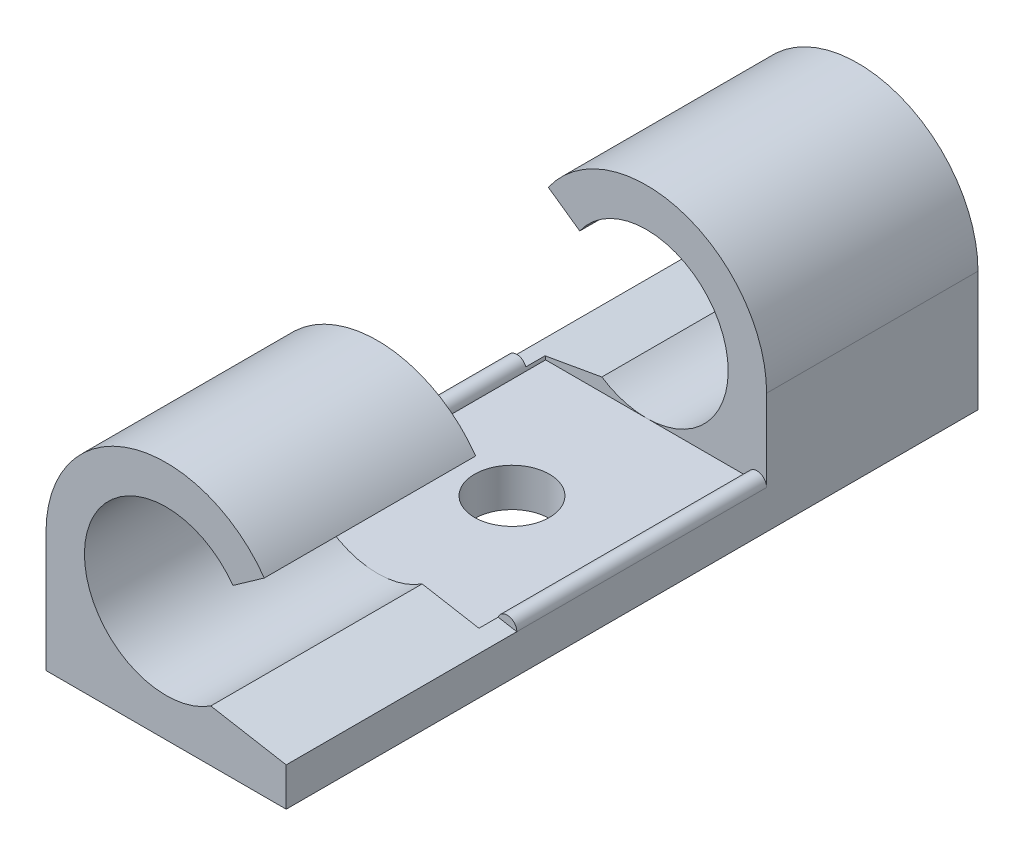
ISO-10303-21;
HEADER;
FILE_DESCRIPTION(('STEP AP214'),'2;1');
FILE_NAME('part.step','',(''),(''),'','','');
FILE_SCHEMA(('AUTOMOTIVE_DESIGN { 1 0 10303 214 1 1 1 1 }'));
ENDSEC;
DATA;
#1=APPLICATION_CONTEXT('core data for automotive mechanical design processes');
#2=APPLICATION_PROTOCOL_DEFINITION('international standard','automotive_design',2000,#1);
#3=PRODUCT_CONTEXT('',#1,'mechanical');
#4=PRODUCT('Part','Part','',(#3));
#5=PRODUCT_RELATED_PRODUCT_CATEGORY('part','',(#4));
#6=PRODUCT_DEFINITION_FORMATION('','',#4);
#7=PRODUCT_DEFINITION_CONTEXT('part definition',#1,'design');
#8=PRODUCT_DEFINITION('design','',#6,#7);
#9=PRODUCT_DEFINITION_SHAPE('','',#8);
#10=(LENGTH_UNIT() NAMED_UNIT(*) SI_UNIT(.MILLI.,.METRE.));
#11=(NAMED_UNIT(*) PLANE_ANGLE_UNIT() SI_UNIT($,.RADIAN.));
#12=(NAMED_UNIT(*) SI_UNIT($,.STERADIAN.) SOLID_ANGLE_UNIT());
#13=UNCERTAINTY_MEASURE_WITH_UNIT(LENGTH_MEASURE(1.E-05),#10,'distance_accuracy_value','');
#14=(GEOMETRIC_REPRESENTATION_CONTEXT(3) GLOBAL_UNCERTAINTY_ASSIGNED_CONTEXT((#13)) GLOBAL_UNIT_ASSIGNED_CONTEXT((#10,
#11,#12)) REPRESENTATION_CONTEXT('',''));
#15=CARTESIAN_POINT('',(0.,0.,0.));
#16=DIRECTION('',(0.,0.,1.));
#17=DIRECTION('',(1.,0.,0.));
#18=AXIS2_PLACEMENT_3D('',#15,#16,#17);
#19=CARTESIAN_POINT('',(0.,0.,11.));
#20=DIRECTION('',(0.,0.,1.));
#21=DIRECTION('',(1.,0.,0.));
#22=AXIS2_PLACEMENT_3D('',#19,#20,#21);
#23=PLANE('',#22);
#24=CARTESIAN_POINT('',(0.,0.,11.));
#25=DIRECTION('',(0.,0.,1.));
#26=DIRECTION('',(1.,0.,0.));
#27=AXIS2_PLACEMENT_3D('',#24,#25,#26);
#28=CIRCLE('',#27,6.25);
#29=CARTESIAN_POINT('',(6.25,0.,11.));
#30=VERTEX_POINT('',#29);
#31=CARTESIAN_POINT('',(-5.10966953026548,3.59913563115876,11.));
#32=VERTEX_POINT('',#31);
#33=EDGE_CURVE('E195',#30,#32,#28,.T.);
#34=ORIENTED_EDGE('',*,*,#33,.T.);
#35=DIRECTION('',(0.817547124842476,-0.575861700985402,0.));
#36=VECTOR('',#35,1.);
#37=CARTESIAN_POINT('',(0.,0.,11.));
#38=LINE('',#37,#36);
#39=CARTESIAN_POINT('',(-3.47457528058052,2.44741222918796,11.));
#40=VERTEX_POINT('',#39);
#41=EDGE_CURVE('E255',#32,#40,#38,.T.);
#42=ORIENTED_EDGE('',*,*,#41,.T.);
#43=CARTESIAN_POINT('',(0.,0.,11.));
#44=DIRECTION('',(0.,0.,1.));
#45=DIRECTION('',(1.,0.,0.));
#46=AXIS2_PLACEMENT_3D('',#43,#44,#45);
#47=CIRCLE('',#46,4.25);
#48=CARTESIAN_POINT('',(0.,-4.25,11.));
#49=VERTEX_POINT('',#48);
#50=EDGE_CURVE('E179',#49,#40,#47,.T.);
#51=ORIENTED_EDGE('',*,*,#50,.F.);
#52=DIRECTION('',(-1.,0.,0.));
#53=VECTOR('',#52,1.);
#54=CARTESIAN_POINT('',(-6.25,-4.25,11.));
#55=LINE('',#54,#53);
#56=CARTESIAN_POINT('',(5.25,-4.25,11.));
#57=VERTEX_POINT('',#56);
#58=EDGE_CURVE('E242',#57,#49,#55,.T.);
#59=ORIENTED_EDGE('',*,*,#58,.F.);
#60=CARTESIAN_POINT('',(5.75,-4.25,11.));
#61=DIRECTION('',(0.,0.,1.));
#62=DIRECTION('',(1.,0.,0.));
#63=AXIS2_PLACEMENT_3D('',#60,#61,#62);
#64=CIRCLE('',#63,0.5);
#65=CARTESIAN_POINT('',(6.25,-4.25,11.));
#66=VERTEX_POINT('',#65);
#67=EDGE_CURVE('E236',#57,#66,#64,.F.);
#68=ORIENTED_EDGE('',*,*,#67,.T.);
#69=DIRECTION('',(0.,-1.,0.));
#70=VECTOR('',#69,1.);
#71=CARTESIAN_POINT('',(6.25,0.,11.));
#72=LINE('',#71,#70);
#73=EDGE_CURVE('E247',#30,#66,#72,.T.);
#74=ORIENTED_EDGE('',*,*,#73,.F.);
#75=EDGE_LOOP('',(#34,#42,#51,#59,#68,#74));
#76=FACE_BOUND('',#75,.T.);
#77=ADVANCED_FACE('F41',(#76),#23,.T.);
#78=CARTESIAN_POINT('',(-2.32467896088748,-3.55785999286188,11.));
#79=VERTEX_POINT('',#78);
#80=EDGE_CURVE('E204',#79,#49,#47,.T.);
#81=ORIENTED_EDGE('',*,*,#80,.F.);
#82=DIRECTION('',(-0.984807753012208,-0.17364817766693,0.));
#83=VECTOR('',#82,1.);
#84=CARTESIAN_POINT('',(0.53833224452301,-3.05303387127734,11.));
#85=LINE('',#84,#83);
#86=CARTESIAN_POINT('',(-5.28015368960705,-4.07898992833716,11.));
#87=VERTEX_POINT('',#86);
#88=EDGE_CURVE('E259',#79,#87,#85,.T.);
#89=ORIENTED_EDGE('',*,*,#88,.T.);
#90=CARTESIAN_POINT('',(-5.75,-4.25,11.));
#91=DIRECTION('',(0.,0.,1.));
#92=DIRECTION('',(1.,0.,0.));
#93=AXIS2_PLACEMENT_3D('',#90,#91,#92);
#94=CIRCLE('',#93,0.5);
#95=CARTESIAN_POINT('',(-5.25,-4.25,11.));
#96=VERTEX_POINT('',#95);
#97=EDGE_CURVE('E228',#96,#87,#94,.T.);
#98=ORIENTED_EDGE('',*,*,#97,.F.);
#99=EDGE_CURVE('E212',#49,#96,#55,.T.);
#100=ORIENTED_EDGE('',*,*,#99,.F.);
#101=EDGE_LOOP('',(#81,#89,#98,#100));
#102=FACE_BOUND('',#101,.T.);
#103=ADVANCED_FACE('F356',(#102),#23,.T.);
#104=CARTESIAN_POINT('',(0.,0.,11.));
#105=DIRECTION('',(0.,0.,-1.));
#106=DIRECTION('',(-1.,0.,0.));
#107=AXIS2_PLACEMENT_3D('',#104,#105,#106);
#108=CYLINDRICAL_SURFACE('',#107,6.25);
#109=DIRECTION('',(0.,0.,-1.));
#110=VECTOR('',#109,1.);
#111=CARTESIAN_POINT('',(-5.10966953026548,3.59913563115876,12.));
#112=LINE('',#111,#110);
#113=CARTESIAN_POINT('',(-5.10966953026548,3.59913563115876,0.));
#114=VERTEX_POINT('',#113);
#115=EDGE_CURVE('E56',#32,#114,#112,.T.);
#116=ORIENTED_EDGE('',*,*,#115,.F.);
#117=ORIENTED_EDGE('',*,*,#33,.F.);
#118=DIRECTION('',(0.,0.,-1.));
#119=VECTOR('',#118,1.);
#120=CARTESIAN_POINT('',(6.25,0.,11.));
#121=LINE('',#120,#119);
#122=CARTESIAN_POINT('',(6.25,0.,0.));
#123=VERTEX_POINT('',#122);
#124=EDGE_CURVE('E208',#30,#123,#121,.T.);
#125=ORIENTED_EDGE('',*,*,#124,.T.);
#126=CARTESIAN_POINT('',(0.,0.,0.));
#127=DIRECTION('',(0.,0.,1.));
#128=DIRECTION('',(1.,0.,0.));
#129=AXIS2_PLACEMENT_3D('',#126,#127,#128);
#130=CIRCLE('',#129,6.25);
#131=EDGE_CURVE('E200',#123,#114,#130,.T.);
#132=ORIENTED_EDGE('',*,*,#131,.T.);
#133=EDGE_LOOP('',(#116,#117,#125,#132));
#134=FACE_BOUND('',#133,.T.);
#135=ADVANCED_FACE('F258',(#134),#108,.T.);
#136=CARTESIAN_POINT('',(0.,0.,11.));
#137=DIRECTION('',(0.,0.,-1.));
#138=DIRECTION('',(-1.,0.,0.));
#139=AXIS2_PLACEMENT_3D('',#136,#137,#138);
#140=CYLINDRICAL_SURFACE('',#139,4.25);
#141=ORIENTED_EDGE('',*,*,#50,.T.);
#142=DIRECTION('',(0.,0.,-1.));
#143=VECTOR('',#142,1.);
#144=CARTESIAN_POINT('',(-3.47457528058052,2.44741222918796,12.));
#145=LINE('',#144,#143);
#146=CARTESIAN_POINT('',(-3.47457528058052,2.44741222918796,0.));
#147=VERTEX_POINT('',#146);
#148=EDGE_CURVE('E165',#40,#147,#145,.T.);
#149=ORIENTED_EDGE('',*,*,#148,.T.);
#150=CARTESIAN_POINT('',(0.,0.,0.));
#151=DIRECTION('',(0.,0.,1.));
#152=DIRECTION('',(1.,0.,0.));
#153=AXIS2_PLACEMENT_3D('',#150,#151,#152);
#154=CIRCLE('',#153,4.25);
#155=CARTESIAN_POINT('',(-2.32467896088748,-3.55785999286188,0.));
#156=VERTEX_POINT('',#155);
#157=EDGE_CURVE('E177',#156,#147,#154,.T.);
#158=ORIENTED_EDGE('',*,*,#157,.F.);
#159=DIRECTION('',(0.,0.,-1.));
#160=VECTOR('',#159,1.);
#161=CARTESIAN_POINT('',(-2.32467896088748,-3.55785999286188,12.));
#162=LINE('',#161,#160);
#163=EDGE_CURVE('E180',#79,#156,#162,.T.);
#164=ORIENTED_EDGE('',*,*,#163,.F.);
#165=ORIENTED_EDGE('',*,*,#80,.T.);
#166=EDGE_LOOP('',(#141,#149,#158,#164,#165));
#167=FACE_BOUND('',#166,.T.);
#168=ADVANCED_FACE('F43',(#167),#140,.F.);
#169=CARTESIAN_POINT('',(-6.25,0.,11.));
#170=DIRECTION('',(1.,0.,0.));
#171=DIRECTION('',(0.,1.,0.));
#172=AXIS2_PLACEMENT_3D('',#169,#170,#171);
#173=PLANE('',#172);
#174=DIRECTION('',(0.,0.,-1.));
#175=VECTOR('',#174,1.);
#176=CARTESIAN_POINT('',(-6.25,-4.25,12.));
#177=LINE('',#176,#175);
#178=CARTESIAN_POINT('',(-6.25,-4.25,12.));
#179=VERTEX_POINT('',#178);
#180=CARTESIAN_POINT('',(-6.25,-4.25,0.));
#181=VERTEX_POINT('',#180);
#182=EDGE_CURVE('E223',#179,#181,#177,.T.);
#183=ORIENTED_EDGE('',*,*,#182,.T.);
#184=DIRECTION('',(0.,-1.,0.));
#185=VECTOR('',#184,1.);
#186=CARTESIAN_POINT('',(-6.25,0.,0.));
#187=LINE('',#186,#185);
#188=CARTESIAN_POINT('',(-6.25,-6.25,0.));
#189=VERTEX_POINT('',#188);
#190=EDGE_CURVE('E202',#181,#189,#187,.T.);
#191=ORIENTED_EDGE('',*,*,#190,.T.);
#192=DIRECTION('',(0.,0.,-1.));
#193=VECTOR('',#192,1.);
#194=CARTESIAN_POINT('',(-6.25,-6.25,11.));
#195=LINE('',#194,#193);
#196=CARTESIAN_POINT('',(-6.25,-6.25,36.));
#197=VERTEX_POINT('',#196);
#198=EDGE_CURVE('E205',#197,#189,#195,.T.);
#199=ORIENTED_EDGE('',*,*,#198,.F.);
#200=DIRECTION('',(0.,-1.,0.));
#201=VECTOR('',#200,1.);
#202=CARTESIAN_POINT('',(-6.25,0.,36.));
#203=LINE('',#202,#201);
#204=CARTESIAN_POINT('',(-6.25,0.,36.));
#205=VERTEX_POINT('',#204);
#206=EDGE_CURVE('E327',#205,#197,#203,.T.);
#207=ORIENTED_EDGE('',*,*,#206,.F.);
#208=DIRECTION('',(0.,0.,1.));
#209=VECTOR('',#208,1.);
#210=CARTESIAN_POINT('',(-6.25,0.,25.));
#211=LINE('',#210,#209);
#212=CARTESIAN_POINT('',(-6.25,0.,25.));
#213=VERTEX_POINT('',#212);
#214=EDGE_CURVE('E317',#213,#205,#211,.T.);
#215=ORIENTED_EDGE('',*,*,#214,.F.);
#216=DIRECTION('',(0.,-1.,0.));
#217=VECTOR('',#216,1.);
#218=CARTESIAN_POINT('',(-6.25,0.,25.));
#219=LINE('',#218,#217);
#220=CARTESIAN_POINT('',(-6.25,-4.25,25.));
#221=VERTEX_POINT('',#220);
#222=EDGE_CURVE('E314',#213,#221,#219,.T.);
#223=ORIENTED_EDGE('',*,*,#222,.T.);
#224=DIRECTION('',(0.,0.,-1.));
#225=VECTOR('',#224,1.);
#226=CARTESIAN_POINT('',(-6.25,-4.25,18.));
#227=LINE('',#226,#225);
#228=EDGE_CURVE('E245',#221,#179,#227,.T.);
#229=ORIENTED_EDGE('',*,*,#228,.T.);
#230=EDGE_LOOP('',(#183,#191,#199,#207,#215,#223,#229));
#231=FACE_BOUND('',#230,.T.);
#232=ADVANCED_FACE('F359',(#231),#173,.F.);
#233=CARTESIAN_POINT('',(0.,0.,0.));
#234=DIRECTION('',(0.,0.,1.));
#235=DIRECTION('',(1.,0.,0.));
#236=AXIS2_PLACEMENT_3D('',#233,#234,#235);
#237=PLANE('',#236);
#238=DIRECTION('',(-0.817547124842476,0.575861700985402,0.));
#239=VECTOR('',#238,1.);
#240=CARTESIAN_POINT('',(0.,0.,0.));
#241=LINE('',#240,#239);
#242=EDGE_CURVE('E162',#147,#114,#241,.T.);
#243=ORIENTED_EDGE('',*,*,#242,.T.);
#244=ORIENTED_EDGE('',*,*,#131,.F.);
#245=DIRECTION('',(0.,-1.,0.));
#246=VECTOR('',#245,1.);
#247=CARTESIAN_POINT('',(6.25,0.,0.));
#248=LINE('',#247,#246);
#249=CARTESIAN_POINT('',(6.25,-6.25,0.));
#250=VERTEX_POINT('',#249);
#251=EDGE_CURVE('E190',#123,#250,#248,.T.);
#252=ORIENTED_EDGE('',*,*,#251,.T.);
#253=DIRECTION('',(1.,0.,0.));
#254=VECTOR('',#253,1.);
#255=CARTESIAN_POINT('',(0.,-6.25,0.));
#256=LINE('',#255,#254);
#257=EDGE_CURVE('E186',#189,#250,#256,.T.);
#258=ORIENTED_EDGE('',*,*,#257,.F.);
#259=ORIENTED_EDGE('',*,*,#190,.F.);
#260=DIRECTION('',(0.984807753012208,0.17364817766693,0.));
#261=VECTOR('',#260,1.);
#262=CARTESIAN_POINT('',(0.53833224452301,-3.05303387127734,0.));
#263=LINE('',#262,#261);
#264=EDGE_CURVE('E171',#181,#156,#263,.T.);
#265=ORIENTED_EDGE('',*,*,#264,.T.);
#266=ORIENTED_EDGE('',*,*,#157,.T.);
#267=EDGE_LOOP('',(#243,#244,#252,#258,#259,#265,#266));
#268=FACE_BOUND('',#267,.T.);
#269=ADVANCED_FACE('F183',(#268),#237,.F.);
#270=CARTESIAN_POINT('',(-5.75,-4.25,9.8819660112501));
#271=DIRECTION('',(0.,0.,1.));
#272=DIRECTION('',(1.,0.,0.));
#273=AXIS2_PLACEMENT_3D('',#270,#271,#272);
#274=CYLINDRICAL_SURFACE('',#273,0.5);
#275=DIRECTION('',(0.,0.,1.));
#276=VECTOR('',#275,1.);
#277=CARTESIAN_POINT('',(-5.28015368960705,-4.07898992833716,9.8819660112501));
#278=LINE('',#277,#276);
#279=CARTESIAN_POINT('',(-5.28015368960705,-4.07898992833716,12.));
#280=VERTEX_POINT('',#279);
#281=EDGE_CURVE('E11',#280,#87,#278,.F.);
#282=ORIENTED_EDGE('',*,*,#281,.F.);
#283=CARTESIAN_POINT('',(-5.75,-4.25,12.));
#284=DIRECTION('',(0.,0.,-1.));
#285=DIRECTION('',(-1.,0.,0.));
#286=AXIS2_PLACEMENT_3D('',#283,#284,#285);
#287=CIRCLE('',#286,0.5);
#288=EDGE_CURVE('E49',#179,#280,#287,.T.);
#289=ORIENTED_EDGE('',*,*,#288,.F.);
#290=ORIENTED_EDGE('',*,*,#228,.F.);
#291=CARTESIAN_POINT('',(-5.75,-4.25,25.));
#292=DIRECTION('',(0.,0.,1.));
#293=DIRECTION('',(1.,0.,0.));
#294=AXIS2_PLACEMENT_3D('',#291,#292,#293);
#295=CIRCLE('',#294,0.5);
#296=CARTESIAN_POINT('',(-5.25,-4.25,25.));
#297=VERTEX_POINT('',#296);
#298=EDGE_CURVE('E296',#297,#221,#295,.T.);
#299=ORIENTED_EDGE('',*,*,#298,.F.);
#300=DIRECTION('',(0.,0.,1.));
#301=VECTOR('',#300,1.);
#302=CARTESIAN_POINT('',(-5.25,-4.25,9.8819660112501));
#303=LINE('',#302,#301);
#304=EDGE_CURVE('E230',#96,#297,#303,.T.);
#305=ORIENTED_EDGE('',*,*,#304,.F.);
#306=ORIENTED_EDGE('',*,*,#97,.T.);
#307=EDGE_LOOP('',(#282,#289,#290,#299,#305,#306));
#308=FACE_BOUND('',#307,.T.);
#309=ADVANCED_FACE('F226',(#308),#274,.T.);
#310=CARTESIAN_POINT('',(6.25,0.,11.));
#311=DIRECTION('',(1.,0.,0.));
#312=DIRECTION('',(0.,0.,-1.));
#313=AXIS2_PLACEMENT_3D('',#310,#311,#312);
#314=PLANE('',#313);
#315=DIRECTION('',(0.,0.,-1.));
#316=VECTOR('',#315,1.);
#317=CARTESIAN_POINT('',(6.25,-4.25,18.));
#318=LINE('',#317,#316);
#319=CARTESIAN_POINT('',(6.25,-4.25,36.));
#320=VERTEX_POINT('',#319);
#321=CARTESIAN_POINT('',(6.25,-4.25,24.));
#322=VERTEX_POINT('',#321);
#323=EDGE_CURVE('E187',#320,#322,#318,.T.);
#324=ORIENTED_EDGE('',*,*,#323,.F.);
#325=DIRECTION('',(0.,-1.,0.));
#326=VECTOR('',#325,1.);
#327=CARTESIAN_POINT('',(6.25,0.,36.));
#328=LINE('',#327,#326);
#329=CARTESIAN_POINT('',(6.25,-6.25,36.));
#330=VERTEX_POINT('',#329);
#331=EDGE_CURVE('E323',#320,#330,#328,.T.);
#332=ORIENTED_EDGE('',*,*,#331,.T.);
#333=DIRECTION('',(0.,0.,-1.));
#334=VECTOR('',#333,1.);
#335=CARTESIAN_POINT('',(6.25,-6.25,11.));
#336=LINE('',#335,#334);
#337=EDGE_CURVE('E210',#330,#250,#336,.T.);
#338=ORIENTED_EDGE('',*,*,#337,.T.);
#339=ORIENTED_EDGE('',*,*,#251,.F.);
#340=ORIENTED_EDGE('',*,*,#124,.F.);
#341=ORIENTED_EDGE('',*,*,#73,.T.);
#342=EDGE_CURVE('E192',#322,#66,#318,.T.);
#343=ORIENTED_EDGE('',*,*,#342,.F.);
#344=EDGE_LOOP('',(#324,#332,#338,#339,#340,#341,#343));
#345=FACE_BOUND('',#344,.T.);
#346=ADVANCED_FACE('F379',(#345),#314,.T.);
#347=CARTESIAN_POINT('',(5.75,-4.25,9.8819660112501));
#348=DIRECTION('',(0.,0.,1.));
#349=DIRECTION('',(1.,0.,0.));
#350=AXIS2_PLACEMENT_3D('',#347,#348,#349);
#351=CYLINDRICAL_SURFACE('',#350,0.5);
#352=CARTESIAN_POINT('',(5.75,-4.25,25.));
#353=DIRECTION('',(0.,0.,1.));
#354=DIRECTION('',(1.,0.,0.));
#355=AXIS2_PLACEMENT_3D('',#352,#353,#354);
#356=CIRCLE('',#355,0.5);
#357=CARTESIAN_POINT('',(5.25,-4.25,25.));
#358=VERTEX_POINT('',#357);
#359=CARTESIAN_POINT('',(5.28015368960705,-4.07898992833716,25.));
#360=VERTEX_POINT('',#359);
#361=EDGE_CURVE('E299',#358,#360,#356,.F.);
#362=ORIENTED_EDGE('',*,*,#361,.T.);
#363=DIRECTION('',(0.,0.,1.));
#364=VECTOR('',#363,1.);
#365=CARTESIAN_POINT('',(5.28015368960705,-4.07898992833716,9.8819660112501));
#366=LINE('',#365,#364);
#367=CARTESIAN_POINT('',(5.28015368960705,-4.07898992833716,24.));
#368=VERTEX_POINT('',#367);
#369=EDGE_CURVE('E289',#360,#368,#366,.F.);
#370=ORIENTED_EDGE('',*,*,#369,.T.);
#371=CARTESIAN_POINT('',(5.75,-4.25,24.));
#372=DIRECTION('',(0.,0.,1.));
#373=DIRECTION('',(1.,0.,0.));
#374=AXIS2_PLACEMENT_3D('',#371,#372,#373);
#375=CIRCLE('',#374,0.5);
#376=EDGE_CURVE('E213',#368,#322,#375,.F.);
#377=ORIENTED_EDGE('',*,*,#376,.T.);
#378=ORIENTED_EDGE('',*,*,#342,.T.);
#379=ORIENTED_EDGE('',*,*,#67,.F.);
#380=DIRECTION('',(0.,0.,1.));
#381=VECTOR('',#380,1.);
#382=CARTESIAN_POINT('',(5.25,-4.25,9.8819660112501));
#383=LINE('',#382,#381);
#384=EDGE_CURVE('E234',#57,#358,#383,.T.);
#385=ORIENTED_EDGE('',*,*,#384,.T.);
#386=EDGE_LOOP('',(#362,#370,#377,#378,#379,#385));
#387=FACE_BOUND('',#386,.T.);
#388=ADVANCED_FACE('F353',(#387),#351,.T.);
#389=CARTESIAN_POINT('',(0.,0.,25.));
#390=DIRECTION('',(0.,0.,-1.));
#391=DIRECTION('',(1.,0.,0.));
#392=AXIS2_PLACEMENT_3D('',#389,#390,#391);
#393=PLANE('',#392);
#394=CARTESIAN_POINT('',(0.,0.,25.));
#395=DIRECTION('',(0.,0.,1.));
#396=DIRECTION('',(1.,0.,0.));
#397=AXIS2_PLACEMENT_3D('',#394,#395,#396);
#398=CIRCLE('',#397,4.25);
#399=CARTESIAN_POINT('',(0.,-4.25,25.));
#400=VERTEX_POINT('',#399);
#401=CARTESIAN_POINT('',(2.32467896088749,-3.55785999286188,25.));
#402=VERTEX_POINT('',#401);
#403=EDGE_CURVE('E308',#400,#402,#398,.T.);
#404=ORIENTED_EDGE('',*,*,#403,.T.);
#405=DIRECTION('',(0.984807753012208,-0.17364817766693,0.));
#406=VECTOR('',#405,1.);
#407=CARTESIAN_POINT('',(-0.538332244523009,-3.05303387127734,25.));
#408=LINE('',#407,#406);
#409=EDGE_CURVE('E286',#402,#360,#408,.T.);
#410=ORIENTED_EDGE('',*,*,#409,.T.);
#411=ORIENTED_EDGE('',*,*,#361,.F.);
#412=DIRECTION('',(-1.,0.,0.));
#413=VECTOR('',#412,1.);
#414=CARTESIAN_POINT('',(-6.25,-4.25,25.));
#415=LINE('',#414,#413);
#416=EDGE_CURVE('E302',#358,#400,#415,.T.);
#417=ORIENTED_EDGE('',*,*,#416,.T.);
#418=EDGE_LOOP('',(#404,#410,#411,#417));
#419=FACE_BOUND('',#418,.T.);
#420=ADVANCED_FACE('F351',(#419),#393,.T.);
#421=CARTESIAN_POINT('',(0.,0.,25.));
#422=DIRECTION('',(0.,0.,1.));
#423=DIRECTION('',(1.,0.,0.));
#424=AXIS2_PLACEMENT_3D('',#421,#422,#423);
#425=CIRCLE('',#424,6.25);
#426=CARTESIAN_POINT('',(5.10943474902635,3.59946892547248,25.));
#427=VERTEX_POINT('',#426);
#428=EDGE_CURVE('E311',#427,#213,#425,.T.);
#429=ORIENTED_EDGE('',*,*,#428,.F.);
#430=DIRECTION('',(-0.817509559844216,-0.575915028075597,0.));
#431=VECTOR('',#430,1.);
#432=CARTESIAN_POINT('',(0.,0.,25.));
#433=LINE('',#432,#431);
#434=CARTESIAN_POINT('',(3.47441562933792,2.44763886932129,25.));
#435=VERTEX_POINT('',#434);
#436=EDGE_CURVE('E279',#427,#435,#433,.T.);
#437=ORIENTED_EDGE('',*,*,#436,.T.);
#438=EDGE_CURVE('E312',#435,#400,#398,.T.);
#439=ORIENTED_EDGE('',*,*,#438,.T.);
#440=EDGE_CURVE('E238',#400,#297,#415,.T.);
#441=ORIENTED_EDGE('',*,*,#440,.T.);
#442=ORIENTED_EDGE('',*,*,#298,.T.);
#443=ORIENTED_EDGE('',*,*,#222,.F.);
#444=EDGE_LOOP('',(#429,#437,#439,#441,#442,#443));
#445=FACE_BOUND('',#444,.T.);
#446=ADVANCED_FACE('F338',(#445),#393,.T.);
#447=CARTESIAN_POINT('',(0.,0.,25.));
#448=DIRECTION('',(0.,0.,1.));
#449=DIRECTION('',(-1.,0.,0.));
#450=AXIS2_PLACEMENT_3D('',#447,#448,#449);
#451=CYLINDRICAL_SURFACE('',#450,6.25);
#452=DIRECTION('',(0.,0.,1.));
#453=VECTOR('',#452,1.);
#454=CARTESIAN_POINT('',(5.10943474902635,3.59946892547248,24.));
#455=LINE('',#454,#453);
#456=CARTESIAN_POINT('',(5.10943474902635,3.59946892547248,36.));
#457=VERTEX_POINT('',#456);
#458=EDGE_CURVE('E271',#427,#457,#455,.T.);
#459=ORIENTED_EDGE('',*,*,#458,.F.);
#460=ORIENTED_EDGE('',*,*,#428,.T.);
#461=ORIENTED_EDGE('',*,*,#214,.T.);
#462=CARTESIAN_POINT('',(0.,0.,36.));
#463=DIRECTION('',(0.,0.,1.));
#464=DIRECTION('',(1.,0.,0.));
#465=AXIS2_PLACEMENT_3D('',#462,#463,#464);
#466=CIRCLE('',#465,6.25);
#467=EDGE_CURVE('E325',#457,#205,#466,.T.);
#468=ORIENTED_EDGE('',*,*,#467,.F.);
#469=EDGE_LOOP('',(#459,#460,#461,#468));
#470=FACE_BOUND('',#469,.T.);
#471=ADVANCED_FACE('F369',(#470),#451,.T.);
#472=CARTESIAN_POINT('',(0.,0.,25.));
#473=DIRECTION('',(0.,0.,1.));
#474=DIRECTION('',(-1.,0.,0.));
#475=AXIS2_PLACEMENT_3D('',#472,#473,#474);
#476=CYLINDRICAL_SURFACE('',#475,4.25);
#477=CARTESIAN_POINT('',(0.,0.,36.));
#478=DIRECTION('',(0.,0.,1.));
#479=DIRECTION('',(1.,0.,0.));
#480=AXIS2_PLACEMENT_3D('',#477,#478,#479);
#481=CIRCLE('',#480,4.25);
#482=CARTESIAN_POINT('',(3.47441562933792,2.44763886932129,36.));
#483=VERTEX_POINT('',#482);
#484=CARTESIAN_POINT('',(2.32467896088749,-3.55785999286187,36.));
#485=VERTEX_POINT('',#484);
#486=EDGE_CURVE('E307',#483,#485,#481,.T.);
#487=ORIENTED_EDGE('',*,*,#486,.T.);
#488=DIRECTION('',(0.,0.,1.));
#489=VECTOR('',#488,1.);
#490=CARTESIAN_POINT('',(2.32467896088749,-3.55785999286188,24.));
#491=LINE('',#490,#489);
#492=EDGE_CURVE('E277',#402,#485,#491,.T.);
#493=ORIENTED_EDGE('',*,*,#492,.F.);
#494=ORIENTED_EDGE('',*,*,#403,.F.);
#495=ORIENTED_EDGE('',*,*,#438,.F.);
#496=DIRECTION('',(0.,0.,1.));
#497=VECTOR('',#496,1.);
#498=CARTESIAN_POINT('',(3.47441562933792,2.44763886932129,24.));
#499=LINE('',#498,#497);
#500=EDGE_CURVE('E280',#435,#483,#499,.T.);
#501=ORIENTED_EDGE('',*,*,#500,.T.);
#502=EDGE_LOOP('',(#487,#493,#494,#495,#501));
#503=FACE_BOUND('',#502,.T.);
#504=ADVANCED_FACE('F349',(#503),#476,.F.);
#505=CARTESIAN_POINT('',(0.,0.,36.));
#506=DIRECTION('',(0.,0.,-1.));
#507=DIRECTION('',(1.,0.,0.));
#508=AXIS2_PLACEMENT_3D('',#505,#506,#507);
#509=PLANE('',#508);
#510=DIRECTION('',(-0.984807753012208,0.17364817766693,0.));
#511=VECTOR('',#510,1.);
#512=CARTESIAN_POINT('',(-0.53833224452301,-3.05303387127734,36.));
#513=LINE('',#512,#511);
#514=EDGE_CURVE('E267',#320,#485,#513,.T.);
#515=ORIENTED_EDGE('',*,*,#514,.T.);
#516=ORIENTED_EDGE('',*,*,#486,.F.);
#517=DIRECTION('',(0.817509559844216,0.575915028075597,0.));
#518=VECTOR('',#517,1.);
#519=CARTESIAN_POINT('',(0.,0.,36.));
#520=LINE('',#519,#518);
#521=EDGE_CURVE('E272',#483,#457,#520,.T.);
#522=ORIENTED_EDGE('',*,*,#521,.T.);
#523=ORIENTED_EDGE('',*,*,#467,.T.);
#524=ORIENTED_EDGE('',*,*,#206,.T.);
#525=DIRECTION('',(1.,0.,0.));
#526=VECTOR('',#525,1.);
#527=CARTESIAN_POINT('',(0.,-6.25,36.));
#528=LINE('',#527,#526);
#529=EDGE_CURVE('E320',#197,#330,#528,.T.);
#530=ORIENTED_EDGE('',*,*,#529,.T.);
#531=ORIENTED_EDGE('',*,*,#331,.F.);
#532=EDGE_LOOP('',(#515,#516,#522,#523,#524,#530,#531));
#533=FACE_BOUND('',#532,.T.);
#534=ADVANCED_FACE('F367',(#533),#509,.F.);
#535=CARTESIAN_POINT('',(-6.25,-4.25,18.));
#536=DIRECTION('',(0.,-1.,0.));
#537=DIRECTION('',(0.,0.,-1.));
#538=AXIS2_PLACEMENT_3D('',#535,#536,#537);
#539=PLANE('',#538);
#540=CARTESIAN_POINT('',(0.,-4.25,18.));
#541=DIRECTION('',(0.,1.,0.));
#542=DIRECTION('',(0.,0.,1.));
#543=AXIS2_PLACEMENT_3D('',#540,#541,#542);
#544=CIRCLE('',#543,1.95);
#545=CARTESIAN_POINT('',(0.,-4.25,19.95));
#546=VERTEX_POINT('',#545);
#547=EDGE_CURVE('E292',#546,#546,#544,.T.);
#548=ORIENTED_EDGE('',*,*,#547,.F.);
#549=EDGE_LOOP('',(#548));
#550=FACE_BOUND('',#549,.T.);
#551=ORIENTED_EDGE('',*,*,#304,.T.);
#552=ORIENTED_EDGE('',*,*,#440,.F.);
#553=ORIENTED_EDGE('',*,*,#416,.F.);
#554=ORIENTED_EDGE('',*,*,#384,.F.);
#555=ORIENTED_EDGE('',*,*,#58,.T.);
#556=ORIENTED_EDGE('',*,*,#99,.T.);
#557=EDGE_LOOP('',(#551,#552,#553,#554,#555,#556));
#558=FACE_BOUND('',#557,.T.);
#559=ADVANCED_FACE('F344',(#550,#558),#539,.F.);
#560=CARTESIAN_POINT('',(0.,-6.25,11.));
#561=DIRECTION('',(0.,1.,0.));
#562=DIRECTION('',(-1.,0.,0.));
#563=AXIS2_PLACEMENT_3D('',#560,#561,#562);
#564=PLANE('',#563);
#565=CARTESIAN_POINT('',(0.,-6.25,18.));
#566=DIRECTION('',(0.,1.,0.));
#567=DIRECTION('',(0.,0.,1.));
#568=AXIS2_PLACEMENT_3D('',#565,#566,#567);
#569=CIRCLE('',#568,1.95);
#570=CARTESIAN_POINT('',(0.,-6.25,19.95));
#571=VERTEX_POINT('',#570);
#572=EDGE_CURVE('E293',#571,#571,#569,.T.);
#573=ORIENTED_EDGE('',*,*,#572,.T.);
#574=EDGE_LOOP('',(#573));
#575=FACE_BOUND('',#574,.T.);
#576=ORIENTED_EDGE('',*,*,#257,.T.);
#577=ORIENTED_EDGE('',*,*,#337,.F.);
#578=ORIENTED_EDGE('',*,*,#529,.F.);
#579=ORIENTED_EDGE('',*,*,#198,.T.);
#580=EDGE_LOOP('',(#576,#577,#578,#579));
#581=FACE_BOUND('',#580,.T.);
#582=ADVANCED_FACE('F363',(#575,#581),#564,.F.);
#583=CARTESIAN_POINT('',(0.,-6.25,18.));
#584=DIRECTION('',(0.,1.,0.));
#585=DIRECTION('',(0.,0.,1.));
#586=AXIS2_PLACEMENT_3D('',#583,#584,#585);
#587=CYLINDRICAL_SURFACE('',#586,1.95);
#588=ORIENTED_EDGE('',*,*,#572,.F.);
#589=EDGE_LOOP('',(#588));
#590=FACE_BOUND('',#589,.T.);
#591=ORIENTED_EDGE('',*,*,#547,.T.);
#592=EDGE_LOOP('',(#591));
#593=FACE_BOUND('',#592,.T.);
#594=ADVANCED_FACE('F504',(#590,#593),#587,.F.);
#595=CARTESIAN_POINT('',(0.,0.,24.));
#596=DIRECTION('',(0.575915028075597,-0.817509559844216,0.));
#597=DIRECTION('',(0.817509559844216,0.575915028075597,0.));
#598=AXIS2_PLACEMENT_3D('',#595,#596,#597);
#599=PLANE('',#598);
#600=ORIENTED_EDGE('',*,*,#458,.T.);
#601=ORIENTED_EDGE('',*,*,#521,.F.);
#602=ORIENTED_EDGE('',*,*,#500,.F.);
#603=ORIENTED_EDGE('',*,*,#436,.F.);
#604=EDGE_LOOP('',(#600,#601,#602,#603));
#605=FACE_BOUND('',#604,.T.);
#606=ADVANCED_FACE('F371',(#605),#599,.T.);
#607=CARTESIAN_POINT('',(-0.53833224452301,-3.05303387127734,24.));
#608=DIRECTION('',(0.17364817766693,0.984807753012208,0.));
#609=DIRECTION('',(-0.984807753012208,0.17364817766693,0.));
#610=AXIS2_PLACEMENT_3D('',#607,#608,#609);
#611=PLANE('',#610);
#612=ORIENTED_EDGE('',*,*,#409,.F.);
#613=ORIENTED_EDGE('',*,*,#492,.T.);
#614=ORIENTED_EDGE('',*,*,#514,.F.);
#615=ORIENTED_EDGE('',*,*,#323,.T.);
#616=DIRECTION('',(-0.984807753012208,0.17364817766693,0.));
#617=VECTOR('',#616,1.);
#618=CARTESIAN_POINT('',(-0.53833224452301,-3.05303387127734,24.));
#619=LINE('',#618,#617);
#620=EDGE_CURVE('E268',#322,#368,#619,.T.);
#621=ORIENTED_EDGE('',*,*,#620,.T.);
#622=ORIENTED_EDGE('',*,*,#369,.F.);
#623=EDGE_LOOP('',(#612,#613,#614,#615,#621,#622));
#624=FACE_BOUND('',#623,.T.);
#625=ADVANCED_FACE('F375',(#624),#611,.T.);
#626=CARTESIAN_POINT('',(0.,0.,24.));
#627=DIRECTION('',(0.,0.,1.));
#628=DIRECTION('',(1.,0.,0.));
#629=AXIS2_PLACEMENT_3D('',#626,#627,#628);
#630=PLANE('',#629);
#631=ORIENTED_EDGE('',*,*,#620,.F.);
#632=ORIENTED_EDGE('',*,*,#376,.F.);
#633=EDGE_LOOP('',(#631,#632));
#634=FACE_BOUND('',#633,.T.);
#635=ADVANCED_FACE('F378',(#634),#630,.T.);
#636=CARTESIAN_POINT('',(0.,0.,12.));
#637=DIRECTION('',(0.,0.,-1.));
#638=DIRECTION('',(-1.,0.,0.));
#639=AXIS2_PLACEMENT_3D('',#636,#637,#638);
#640=PLANE('',#639);
#641=ORIENTED_EDGE('',*,*,#288,.T.);
#642=DIRECTION('',(0.984807753012208,0.17364817766693,0.));
#643=VECTOR('',#642,1.);
#644=CARTESIAN_POINT('',(0.53833224452301,-3.05303387127734,12.));
#645=LINE('',#644,#643);
#646=EDGE_CURVE('E63',#179,#280,#645,.T.);
#647=ORIENTED_EDGE('',*,*,#646,.F.);
#648=EDGE_LOOP('',(#641,#647));
#649=FACE_BOUND('',#648,.T.);
#650=ADVANCED_FACE('F216',(#649),#640,.T.);
#651=CARTESIAN_POINT('',(0.53833224452301,-3.05303387127734,12.));
#652=DIRECTION('',(-0.17364817766693,0.984807753012208,0.));
#653=DIRECTION('',(-0.984807753012208,-0.17364817766693,0.));
#654=AXIS2_PLACEMENT_3D('',#651,#652,#653);
#655=PLANE('',#654);
#656=ORIENTED_EDGE('',*,*,#163,.T.);
#657=ORIENTED_EDGE('',*,*,#264,.F.);
#658=ORIENTED_EDGE('',*,*,#182,.F.);
#659=ORIENTED_EDGE('',*,*,#646,.T.);
#660=ORIENTED_EDGE('',*,*,#281,.T.);
#661=ORIENTED_EDGE('',*,*,#88,.F.);
#662=EDGE_LOOP('',(#656,#657,#658,#659,#660,#661));
#663=FACE_BOUND('',#662,.T.);
#664=ADVANCED_FACE('F221',(#663),#655,.T.);
#665=CARTESIAN_POINT('',(0.,0.,12.));
#666=DIRECTION('',(-0.575861700985402,-0.817547124842476,0.));
#667=DIRECTION('',(0.817547124842476,-0.575861700985402,0.));
#668=AXIS2_PLACEMENT_3D('',#665,#666,#667);
#669=PLANE('',#668);
#670=ORIENTED_EDGE('',*,*,#115,.T.);
#671=ORIENTED_EDGE('',*,*,#242,.F.);
#672=ORIENTED_EDGE('',*,*,#148,.F.);
#673=ORIENTED_EDGE('',*,*,#41,.F.);
#674=EDGE_LOOP('',(#670,#671,#672,#673));
#675=FACE_BOUND('',#674,.T.);
#676=ADVANCED_FACE('F164',(#675),#669,.T.);
#677=CLOSED_SHELL('',(#77,#103,#135,#168,#232,#269,#309,#346,#388,#420,#446,#471,#504,#534,#559,
#582,#594,#606,#625,#635,#650,#664,#676));
#678=MANIFOLD_SOLID_BREP('B2',#677);
#679=ADVANCED_BREP_SHAPE_REPRESENTATION('',(#18,#678),#14);
#680=SHAPE_DEFINITION_REPRESENTATION(#9,#679);
ENDSEC;
END-ISO-10303-21;
